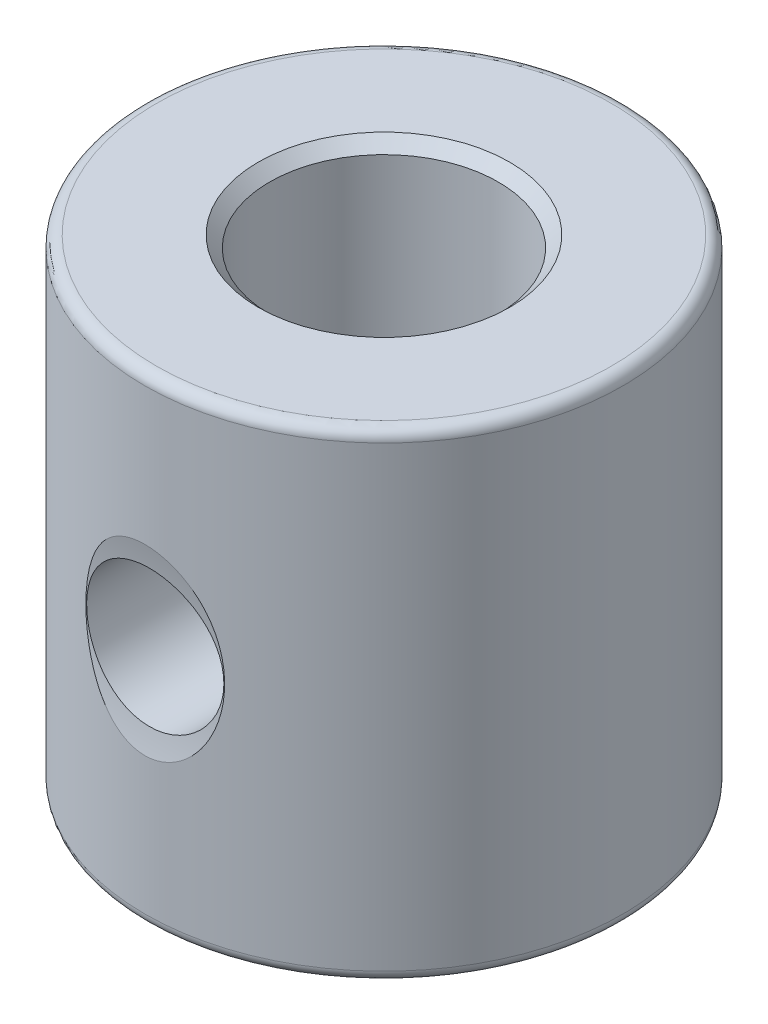
ISO-10303-21;
HEADER;
FILE_DESCRIPTION(('STEP AP214'),'2;1');
FILE_NAME('part.step','',(''),(''),'','','');
FILE_SCHEMA(('AUTOMOTIVE_DESIGN { 1 0 10303 214 1 1 1 1 }'));
ENDSEC;
DATA;
#1=APPLICATION_CONTEXT('core data for automotive mechanical design processes');
#2=APPLICATION_PROTOCOL_DEFINITION('international standard','automotive_design',2000,#1);
#3=PRODUCT_CONTEXT('',#1,'mechanical');
#4=PRODUCT('Part','Part','',(#3));
#5=PRODUCT_RELATED_PRODUCT_CATEGORY('part','',(#4));
#6=PRODUCT_DEFINITION_FORMATION('','',#4);
#7=PRODUCT_DEFINITION_CONTEXT('part definition',#1,'design');
#8=PRODUCT_DEFINITION('design','',#6,#7);
#9=PRODUCT_DEFINITION_SHAPE('','',#8);
#10=(LENGTH_UNIT() NAMED_UNIT(*) SI_UNIT(.MILLI.,.METRE.));
#11=(NAMED_UNIT(*) PLANE_ANGLE_UNIT() SI_UNIT($,.RADIAN.));
#12=(NAMED_UNIT(*) SI_UNIT($,.STERADIAN.) SOLID_ANGLE_UNIT());
#13=UNCERTAINTY_MEASURE_WITH_UNIT(LENGTH_MEASURE(1.E-05),#10,'distance_accuracy_value','');
#14=(GEOMETRIC_REPRESENTATION_CONTEXT(3) GLOBAL_UNCERTAINTY_ASSIGNED_CONTEXT((#13)) GLOBAL_UNIT_ASSIGNED_CONTEXT((#10,
#11,#12)) REPRESENTATION_CONTEXT('',''));
#15=CARTESIAN_POINT('',(0.,0.,0.));
#16=DIRECTION('',(0.,0.,1.));
#17=DIRECTION('',(1.,0.,0.));
#18=AXIS2_PLACEMENT_3D('',#15,#16,#17);
#19=CARTESIAN_POINT('',(0.,5.25,0.));
#20=DIRECTION('',(0.,1.,0.));
#21=DIRECTION('',(0.,0.,1.));
#22=AXIS2_PLACEMENT_3D('',#19,#20,#21);
#23=PLANE('',#22);
#24=CARTESIAN_POINT('',(0.,5.25,0.));
#25=DIRECTION('',(0.,1.,0.));
#26=DIRECTION('',(0.,0.,1.));
#27=AXIS2_PLACEMENT_3D('',#24,#25,#26);
#28=CIRCLE('',#27,2.75);
#29=CARTESIAN_POINT('',(0.,5.25,2.75));
#30=VERTEX_POINT('',#29);
#31=EDGE_CURVE('E10',#30,#30,#28,.F.);
#32=ORIENTED_EDGE('',*,*,#31,.T.);
#33=EDGE_LOOP('',(#32));
#34=FACE_BOUND('',#33,.T.);
#35=CARTESIAN_POINT('',(0.,5.25,0.));
#36=DIRECTION('',(0.,1.,0.));
#37=DIRECTION('',(0.,0.,1.));
#38=AXIS2_PLACEMENT_3D('',#35,#36,#37);
#39=CIRCLE('',#38,4.975);
#40=CARTESIAN_POINT('',(0.,5.25,4.975));
#41=VERTEX_POINT('',#40);
#42=EDGE_CURVE('E54',#41,#41,#39,.T.);
#43=ORIENTED_EDGE('',*,*,#42,.T.);
#44=EDGE_LOOP('',(#43));
#45=FACE_BOUND('',#44,.T.);
#46=ADVANCED_FACE('F42',(#34,#45),#23,.T.);
#47=CARTESIAN_POINT('',(0.,-5.25,0.));
#48=DIRECTION('',(0.,1.,0.));
#49=DIRECTION('',(0.,0.,1.));
#50=AXIS2_PLACEMENT_3D('',#47,#48,#49);
#51=PLANE('',#50);
#52=CARTESIAN_POINT('',(0.,-5.25,0.));
#53=DIRECTION('',(0.,1.,0.));
#54=DIRECTION('',(0.,0.,1.));
#55=AXIS2_PLACEMENT_3D('',#52,#53,#54);
#56=CIRCLE('',#55,4.975);
#57=CARTESIAN_POINT('',(0.,-5.25,4.975));
#58=VERTEX_POINT('',#57);
#59=EDGE_CURVE('E58',#58,#58,#56,.F.);
#60=ORIENTED_EDGE('',*,*,#59,.T.);
#61=EDGE_LOOP('',(#60));
#62=FACE_BOUND('',#61,.T.);
#63=CARTESIAN_POINT('',(0.,-5.25,0.));
#64=DIRECTION('',(0.,1.,0.));
#65=DIRECTION('',(0.,0.,1.));
#66=AXIS2_PLACEMENT_3D('',#63,#64,#65);
#67=CIRCLE('',#66,2.5);
#68=CARTESIAN_POINT('',(0.,-5.25,2.5));
#69=VERTEX_POINT('',#68);
#70=EDGE_CURVE('E69',#69,#69,#67,.T.);
#71=ORIENTED_EDGE('',*,*,#70,.T.);
#72=EDGE_LOOP('',(#71));
#73=FACE_BOUND('',#72,.T.);
#74=ADVANCED_FACE('F112',(#62,#73),#51,.F.);
#75=CARTESIAN_POINT('',(0.,5.25,0.));
#76=DIRECTION('',(0.,-1.,0.));
#77=DIRECTION('',(0.,0.,-1.));
#78=AXIS2_PLACEMENT_3D('',#75,#76,#77);
#79=CYLINDRICAL_SURFACE('',#78,5.225);
#80=CARTESIAN_POINT('',(0.,-5.,0.));
#81=DIRECTION('',(0.,1.,0.));
#82=DIRECTION('',(0.,0.,1.));
#83=AXIS2_PLACEMENT_3D('',#80,#81,#82);
#84=CIRCLE('',#83,5.225);
#85=CARTESIAN_POINT('',(0.,-5.,5.225));
#86=VERTEX_POINT('',#85);
#87=EDGE_CURVE('E63',#86,#86,#84,.T.);
#88=ORIENTED_EDGE('',*,*,#87,.T.);
#89=EDGE_LOOP('',(#88));
#90=FACE_BOUND('',#89,.T.);
#91=CARTESIAN_POINT('',(0.,5.,0.));
#92=DIRECTION('',(0.,1.,0.));
#93=DIRECTION('',(0.,0.,1.));
#94=AXIS2_PLACEMENT_3D('',#91,#92,#93);
#95=CIRCLE('',#94,5.225);
#96=CARTESIAN_POINT('',(0.,5.,5.225));
#97=VERTEX_POINT('',#96);
#98=EDGE_CURVE('E66',#97,#97,#95,.F.);
#99=ORIENTED_EDGE('',*,*,#98,.T.);
#100=EDGE_LOOP('',(#99));
#101=FACE_BOUND('',#100,.T.);
#102=CARTESIAN_POINT('',(-1.51678113121175,0.,5.));
#103=CARTESIAN_POINT('',(-1.51678321022055,0.132246562424827,5.00000483225481));
#104=CARTESIAN_POINT('',(-1.50719327837875,0.264644992566501,5.00294030867008));
#105=CARTESIAN_POINT('',(-1.46839893936603,0.526672873017801,5.01446209397624));
#106=CARTESIAN_POINT('',(-1.43913554430422,0.656292782735162,5.02306539541794));
#107=CARTESIAN_POINT('',(-1.35960828719544,0.909631952310207,5.04517840997567));
#108=CARTESIAN_POINT('',(-1.30919671564784,1.03330275281817,5.05872254382973));
#109=CARTESIAN_POINT('',(-1.18589710394196,1.26832312229336,5.08903616845833));
#110=CARTESIAN_POINT('',(-1.11308892170455,1.37971458790452,5.10579412126831));
#111=CARTESIAN_POINT('',(-0.975804598333927,1.54491640050493,5.13335164035832));
#112=CARTESIAN_POINT('',(-0.918421954835064,1.60466680696672,5.14403196120628));
#113=CARTESIAN_POINT('',(-0.794666170189511,1.71427691010474,5.16459690415331));
#114=CARTESIAN_POINT('',(-0.728297055439117,1.76414101183159,5.17448187946343));
#115=CARTESIAN_POINT('',(-0.586755893144599,1.85175029324499,5.19244321625354));
#116=CARTESIAN_POINT('',(-0.511504458701384,1.88937280416208,5.20050103936119));
#117=CARTESIAN_POINT('',(-0.354805995663198,1.94906887648696,5.21352826217495));
#118=CARTESIAN_POINT('',(-0.273366984157227,1.9711621904581,5.21850158430093));
#119=CARTESIAN_POINT('',(-0.120094405397051,1.995904616155,5.2240957822282));
#120=CARTESIAN_POINT('',(-0.0486684616039803,2.00098703607869,5.2252607001651));
#121=CARTESIAN_POINT('',(0.09391349441082,1.99827064623499,5.22464135172689));
#122=CARTESIAN_POINT('',(0.165069597394887,1.99047664136749,5.22285818544342));
#123=CARTESIAN_POINT('',(0.299156205285173,1.9636781898376,5.21682682191889));
#124=CARTESIAN_POINT('',(0.362289659063328,1.94561927443901,5.21278697764039));
#125=CARTESIAN_POINT('',(0.484855091333049,1.90003844753162,5.20281889880508));
#126=CARTESIAN_POINT('',(0.544286738712234,1.87251569095011,5.19689049561307));
#127=CARTESIAN_POINT('',(0.662444748262349,1.80700293537155,5.18320181830283));
#128=CARTESIAN_POINT('',(0.72082270646492,1.76840941392818,5.17534150375361));
#129=CARTESIAN_POINT('',(0.831410504796924,1.68340687762648,5.15873184924829));
#130=CARTESIAN_POINT('',(0.883616370462198,1.63699287298182,5.14998194311919));
#131=CARTESIAN_POINT('',(1.00422502911845,1.51488842964339,5.12810615314578));
#132=CARTESIAN_POINT('',(1.06895577339638,1.43558416998177,5.1148275720386));
#133=CARTESIAN_POINT('',(1.18468644922787,1.26734731837281,5.08926948535221));
#134=CARTESIAN_POINT('',(1.23565667881344,1.17839447066111,5.07699218023252));
#135=CARTESIAN_POINT('',(1.33662312589042,0.968532563673905,5.05148489699328));
#136=CARTESIAN_POINT('',(1.38249899544552,0.845561360297463,5.0389209793328));
#137=CARTESIAN_POINT('',(1.45416080847563,0.593623034095723,5.01870603572134));
#138=CARTESIAN_POINT('',(1.47993827963615,0.464653406932462,5.01105708187161));
#139=CARTESIAN_POINT('',(1.5125453789755,0.202541371241045,5.00131234857186));
#140=CARTESIAN_POINT('',(1.51913762399179,0.0693671276810601,4.99928615493248));
#141=CARTESIAN_POINT('',(1.51294178089214,-0.196605147736394,5.00116355855813));
#142=CARTESIAN_POINT('',(1.50013598443562,-0.329402724827907,5.00507257404298));
#143=CARTESIAN_POINT('',(1.45237112724862,-0.604355028281176,5.0191587140662));
#144=CARTESIAN_POINT('',(1.4153386949208,-0.746129623197173,5.02991966770397));
#145=CARTESIAN_POINT('',(1.31563783370383,-1.01981710810465,5.05691666142625));
#146=CARTESIAN_POINT('',(1.25302772245074,-1.15175162971596,5.07314023193593));
#147=CARTESIAN_POINT('',(1.12858769972324,-1.35275591369665,5.10189278921466));
#148=CARTESIAN_POINT('',(1.07498227580127,-1.42706805573394,5.11357836914098));
#149=CARTESIAN_POINT('',(0.956596412372014,-1.56616949476311,5.13704054090297));
#150=CARTESIAN_POINT('',(0.891834254581806,-1.63097405441703,5.14881695420563));
#151=CARTESIAN_POINT('',(0.763935438655142,-1.73754471173015,5.16918136051242));
#152=CARTESIAN_POINT('',(0.702541959894916,-1.78135836354408,5.17796467040403));
#153=CARTESIAN_POINT('',(0.573188007724139,-1.85840629307536,5.19387282629748));
#154=CARTESIAN_POINT('',(0.505229932057441,-1.89164441464088,5.20099827462237));
#155=CARTESIAN_POINT('',(0.363755155049785,-1.9457762037588,5.21280818602999));
#156=CARTESIAN_POINT('',(0.290203117676717,-1.96658251037029,5.21747534772415));
#157=CARTESIAN_POINT('',(0.140367791148149,-1.9939651874736,5.22365048796671));
#158=CARTESIAN_POINT('',(0.0640864035238684,-2.00055127620779,5.22516062403629));
#159=CARTESIAN_POINT('',(-0.079178732952558,-1.99910518940569,5.22483223186299));
#160=CARTESIAN_POINT('',(-0.146185759766913,-1.99272361178179,5.2233717922668));
#161=CARTESIAN_POINT('',(-0.278102904485085,-1.96896408019153,5.21801121622705));
#162=CARTESIAN_POINT('',(-0.3430131051473,-1.95158656077623,5.21411117619468));
#163=CARTESIAN_POINT('',(-0.468653420259433,-1.90696495854449,5.20431948845676));
#164=CARTESIAN_POINT('',(-0.529408597969502,-1.8797876717991,5.19844134138564));
#165=CARTESIAN_POINT('',(-0.646089137239095,-1.81684472491262,5.185233589907));
#166=CARTESIAN_POINT('',(-0.702013237211039,-1.78107683058334,5.17790360800299));
#167=CARTESIAN_POINT('',(-0.815004339151255,-1.69740474362436,5.16140022991208));
#168=CARTESIAN_POINT('',(-0.87134206973075,-1.64854280589884,5.1521109394623));
#169=CARTESIAN_POINT('',(-0.976666330217274,-1.54353336918077,5.13318754711435));
#170=CARTESIAN_POINT('',(-1.02564714465205,-1.48738026829453,5.12355318425727));
#171=CARTESIAN_POINT('',(-1.1394305972897,-1.33914346780779,5.09972992710893));
#172=CARTESIAN_POINT('',(-1.19950070217935,-1.24337927966437,5.08573366380371));
#173=CARTESIAN_POINT('',(-1.30349087790626,-1.04310872530245,5.06007991409564));
#174=CARTESIAN_POINT('',(-1.34737614517184,-0.93858410593995,5.04842749200689));
#175=CARTESIAN_POINT('',(-1.42045996445929,-0.722242709805271,5.02835688987399));
#176=CARTESIAN_POINT('',(-1.44938886627917,-0.610330512029696,5.01999869640888));
#177=CARTESIAN_POINT('',(-1.49211250846632,-0.383658050304542,5.00746706776384));
#178=CARTESIAN_POINT('',(-1.5059379766792,-0.268904056542488,5.00328513749608));
#179=CARTESIAN_POINT('',(-1.51533586059249,-0.102587605252344,5.00043733088112));
#180=CARTESIAN_POINT('',(-1.51678032465749,-0.051305231145879,4.99999812532027));
#181=CARTESIAN_POINT('',(-1.51678113121175,0.,5.));
#182=B_SPLINE_CURVE_WITH_KNOTS('',3,(#102,#103,#104,#105,#106,#107,#108,#109,#110,#111,#112,
#113,#114,#115,#116,#117,#118,#119,#120,#121,#122,#123,#124,#125,#126,#127,#128,#129,#130,#131,
#132,#133,#134,#135,#136,#137,#138,#139,#140,#141,#142,#143,#144,#145,#146,#147,#148,#149,#150,
#151,#152,#153,#154,#155,#156,#157,#158,#159,#160,#161,#162,#163,#164,#165,#166,#167,#168,#169,
#170,#171,#172,#173,#174,#175,#176,#177,#178,#179,#180,#181),.UNSPECIFIED.,.T.,.F.,(4,2,2,2,2,2,
2,2,2,2,2,2,2,2,2,2,2,2,2,2,2,2,2,2,2,2,2,2,2,2,2,2,2,2,2,2,2,2,2,4),(0.,0.39661586491243,
0.794426257563585,1.19506267618054,1.59428681678833,1.84398007798795,2.09356183183857,
2.34557260493653,2.59726224674101,2.81092737260801,3.0245127863121,3.22103169732319,
3.4175681610289,3.62803147545051,3.83862958608082,4.14660285054154,4.4552356524094,
4.84871981990921,5.24236976787901,5.64087014998841,6.03973453969841,6.4782025811379,
6.91567643691321,7.19184454416813,7.46756434631155,7.69445639022458,7.92126587208373,
8.14965099800069,8.37787999371812,8.57887470278069,8.77986146918477,8.97950341496902,
9.17919733863566,9.40382685703782,9.62862999384581,9.96848832867347,10.3090732850905,
10.6556015297924,11.0014234442594,11.1552911006457),.UNSPECIFIED.);
#183=CARTESIAN_POINT('',(-1.51678113121175,0.,5.));
#184=VERTEX_POINT('',#183);
#185=EDGE_CURVE('E78',#184,#184,#182,.T.);
#186=ORIENTED_EDGE('',*,*,#185,.T.);
#187=EDGE_LOOP('',(#186));
#188=FACE_BOUND('',#187,.T.);
#189=CARTESIAN_POINT('',(0.,1.5,-5.225));
#190=CARTESIAN_POINT('',(-0.0824495164985992,1.49999858607525,-5.22499904292199));
#191=CARTESIAN_POINT('',(-0.164913536229548,1.49317942583963,-5.22302956290618));
#192=CARTESIAN_POINT('',(-0.3274504165581,1.46614106062343,-5.21536484167336));
#193=CARTESIAN_POINT('',(-0.4075223788601,1.44591688611996,-5.2096682187356));
#194=CARTESIAN_POINT('',(-0.562906647574482,1.39279188993011,-5.19517524493691));
#195=CARTESIAN_POINT('',(-0.63822545505226,1.35990883971514,-5.18638324107416));
#196=CARTESIAN_POINT('',(-0.782280086892446,1.28246963544211,-5.1666194155132));
#197=CARTESIAN_POINT('',(-0.851015203470135,1.23791222824251,-5.15564735983582));
#198=CARTESIAN_POINT('',(-0.981774047674085,1.13714300060406,-5.13237413354688));
#199=CARTESIAN_POINT('',(-1.04359842097068,1.08067838683339,-5.12004748940824));
#200=CARTESIAN_POINT('',(-1.15704334957944,0.958236961618635,-5.09561087413215));
#201=CARTESIAN_POINT('',(-1.20866235795317,0.89225871070604,-5.08350093609583));
#202=CARTESIAN_POINT('',(-1.30124916910646,0.751014520317421,-5.06060303311927));
#203=CARTESIAN_POINT('',(-1.3419792739964,0.675587122576367,-5.04984692403333));
#204=CARTESIAN_POINT('',(-1.41009779264294,0.518595368105334,-5.03125280899525));
#205=CARTESIAN_POINT('',(-1.43748910750096,0.437032350292604,-5.02341416859984));
#206=CARTESIAN_POINT('',(-1.47744422828539,0.272311432022153,-5.01180699088508));
#207=CARTESIAN_POINT('',(-1.49037319160683,0.189249335112857,-5.00793843296186));
#208=CARTESIAN_POINT('',(-1.5021761878103,0.0220519028465292,-5.00441135169317));
#209=CARTESIAN_POINT('',(-1.50105330709256,-0.0620831927774272,-5.00475190384262));
#210=CARTESIAN_POINT('',(-1.48507252937531,-0.22611777880433,-5.00951556540055));
#211=CARTESIAN_POINT('',(-1.47066569707202,-0.306065741568654,-5.01380459433462));
#212=CARTESIAN_POINT('',(-1.42925220446176,-0.462358727517765,-5.02576592329153));
#213=CARTESIAN_POINT('',(-1.40224439530918,-0.538703421489377,-5.03343853179573));
#214=CARTESIAN_POINT('',(-1.33604943281944,-0.686754861869461,-5.05141381890988));
#215=CARTESIAN_POINT('',(-1.29671129372482,-0.758390012324849,-5.06174880261282));
#216=CARTESIAN_POINT('',(-1.20707740700734,-0.894196488732472,-5.08386809046487));
#217=CARTESIAN_POINT('',(-1.15677919942196,-0.958366134101287,-5.09565271972464));
#218=CARTESIAN_POINT('',(-1.04438621900762,-1.07998620247547,-5.11989302539654));
#219=CARTESIAN_POINT('',(-0.981915278301574,-1.13708786414149,-5.13235716963812));
#220=CARTESIAN_POINT('',(-0.848129684395266,-1.2400817626457,-5.15615270470673));
#221=CARTESIAN_POINT('',(-0.776814564388958,-1.28597340742623,-5.1674840356855));
#222=CARTESIAN_POINT('',(-0.626768862071928,-1.3654325911413,-5.18782637306562));
#223=CARTESIAN_POINT('',(-0.547998381865395,-1.3989284951806,-5.19682380520067));
#224=CARTESIAN_POINT('',(-0.3856250678235,-1.45209715472824,-5.2113867643945));
#225=CARTESIAN_POINT('',(-0.302023469993159,-1.47177342908747,-5.21695316504231));
#226=CARTESIAN_POINT('',(-0.135330517791554,-1.49617694983916,-5.22389111514313));
#227=CARTESIAN_POINT('',(-0.052313865600352,-1.50137744200586,-5.22539541289476));
#228=CARTESIAN_POINT('',(0.113408569933314,-1.49800039973381,-5.22442599408047));
#229=CARTESIAN_POINT('',(0.196114389747752,-1.48942453578542,-5.22195275982121));
#230=CARTESIAN_POINT('',(0.35712014762491,-1.45912328919309,-5.2133926592024));
#231=CARTESIAN_POINT('',(0.435475522333118,-1.43766940578765,-5.20738045218129));
#232=CARTESIAN_POINT('',(0.587461852887813,-1.3825431973504,-5.19243200422949));
#233=CARTESIAN_POINT('',(0.661092258978544,-1.34886945354565,-5.18349542377959));
#234=CARTESIAN_POINT('',(0.803319129185434,-1.26943198030226,-5.16338825649625));
#235=CARTESIAN_POINT('',(0.871770921777237,-1.22342077027359,-5.15217322888593));
#236=CARTESIAN_POINT('',(1.00014523868148,-1.12091919858366,-5.12880094150437));
#237=CARTESIAN_POINT('',(1.0600657984176,-1.06442643010009,-5.116643465698));
#238=CARTESIAN_POINT('',(1.17172562333316,-0.940346448017199,-5.09225514610833));
#239=CARTESIAN_POINT('',(1.22312909697744,-0.872454301496108,-5.08003515404982));
#240=CARTESIAN_POINT('',(1.31383058167793,-0.728743871428044,-5.05733805554333));
#241=CARTESIAN_POINT('',(1.3531290056246,-0.652925858342176,-5.04686088965498));
#242=CARTESIAN_POINT('',(1.41821961789411,-0.495824348017976,-5.0289580229563));
#243=CARTESIAN_POINT('',(1.44408269934611,-0.414572145936182,-5.02151635069317));
#244=CARTESIAN_POINT('',(1.48169600201518,-0.248616359459189,-5.01054819382922));
#245=CARTESIAN_POINT('',(1.4934505509538,-0.163913841678111,-5.00702050865762));
#246=CARTESIAN_POINT('',(1.50223633057733,0.00307077393275622,-5.00439099509517));
#247=CARTESIAN_POINT('',(1.49981170925004,0.0853220610257415,-5.00512558644907));
#248=CARTESIAN_POINT('',(1.48159220103079,0.248190643094908,-5.01054866722178));
#249=CARTESIAN_POINT('',(1.46579776832926,0.328807993482852,-5.0152370223259));
#250=CARTESIAN_POINT('',(1.42162454341136,0.485313040788899,-5.02793441867644));
#251=CARTESIAN_POINT('',(1.39337830460819,0.561241198905154,-5.03590842623189));
#252=CARTESIAN_POINT('',(1.32520584596704,0.707340772140516,-5.05427493283382));
#253=CARTESIAN_POINT('',(1.28527754255945,0.777511157463487,-5.0646678632427));
#254=CARTESIAN_POINT('',(1.19329798796334,0.912657666779304,-5.08713815227838));
#255=CARTESIAN_POINT('',(1.140883784404,0.977379309847944,-5.09926044744725));
#256=CARTESIAN_POINT('',(1.02608829683388,1.09728500036482,-5.12359297007803));
#257=CARTESIAN_POINT('',(0.963704499418225,1.15246663538715,-5.13580321897045));
#258=CARTESIAN_POINT('',(0.828786708500054,1.25314760175575,-5.1593159162724));
#259=CARTESIAN_POINT('',(0.756031102240528,1.29835811008878,-5.17058653473877));
#260=CARTESIAN_POINT('',(0.603628164623409,1.37583834607352,-5.19058264155035));
#261=CARTESIAN_POINT('',(0.523984577518027,1.40811505134721,-5.19930950152625));
#262=CARTESIAN_POINT('',(0.370722796071474,1.45538296662693,-5.21232389994314));
#263=CARTESIAN_POINT('',(0.297660522381918,1.47207170579655,-5.21704006335329));
#264=CARTESIAN_POINT('',(0.149735987660759,1.49438010794722,-5.22337833648225));
#265=CARTESIAN_POINT('',(0.0748739740943221,1.50000128401196,-5.22500086914074));
#266=CARTESIAN_POINT('',(0.,1.5,-5.225));
#267=B_SPLINE_CURVE_WITH_KNOTS('',3,(#189,#190,#191,#192,#193,#194,#195,#196,#197,#198,#199,
#200,#201,#202,#203,#204,#205,#206,#207,#208,#209,#210,#211,#212,#213,#214,#215,#216,#217,#218,
#219,#220,#221,#222,#223,#224,#225,#226,#227,#228,#229,#230,#231,#232,#233,#234,#235,#236,#237,
#238,#239,#240,#241,#242,#243,#244,#245,#246,#247,#248,#249,#250,#251,#252,#253,#254,#255,#256,
#257,#258,#259,#260,#261,#262,#263,#264,#265,#266),.UNSPECIFIED.,.T.,.F.,(4,2,2,2,2,2,2,2,2,2,2,
2,2,2,2,2,2,2,2,2,2,2,2,2,2,2,2,2,2,2,2,2,2,2,2,2,2,2,4),(0.,0.247073701447568,
0.494239049620807,0.74105866667298,0.987904788544549,1.24064287522474,1.49341924284957,
1.75133107017492,2.00918677824834,2.26037365184566,2.51150535477541,2.75441179327978,
2.99734038217353,3.24336820437644,3.48945130394989,3.74490189394383,4.00036597265916,
4.25728413794885,4.51413686119651,4.76248793864931,5.01080890387478,5.25407000557068,
5.49735935985988,5.74595063585013,5.99459906528555,6.25146426805533,6.50832070845414,
6.7638076856233,7.01921627339957,7.26488912847212,7.51055363804316,7.75366385029519,
7.99681744924082,8.24815901430193,8.49956404459484,8.75750120550819,9.01529902465739,
9.23970203321968,9.46407436076253),.UNSPECIFIED.);
#268=CARTESIAN_POINT('',(0.,1.5,-5.225));
#269=VERTEX_POINT('',#268);
#270=EDGE_CURVE('E101',#269,#269,#267,.T.);
#271=ORIENTED_EDGE('',*,*,#270,.T.);
#272=EDGE_LOOP('',(#271));
#273=FACE_BOUND('',#272,.T.);
#274=ADVANCED_FACE('F106',(#90,#101,#188,#273),#79,.T.);
#275=CARTESIAN_POINT('',(0.,5.25,0.));
#276=DIRECTION('',(0.,-1.,0.));
#277=DIRECTION('',(0.,0.,-1.));
#278=AXIS2_PLACEMENT_3D('',#275,#276,#277);
#279=CYLINDRICAL_SURFACE('',#278,2.5);
#280=CARTESIAN_POINT('',(0.,5.,0.));
#281=DIRECTION('',(0.,1.,0.));
#282=DIRECTION('',(0.,0.,1.));
#283=AXIS2_PLACEMENT_3D('',#280,#281,#282);
#284=CIRCLE('',#283,2.5);
#285=CARTESIAN_POINT('',(0.,5.,2.5));
#286=VERTEX_POINT('',#285);
#287=EDGE_CURVE('E50',#286,#286,#284,.T.);
#288=ORIENTED_EDGE('',*,*,#287,.T.);
#289=EDGE_LOOP('',(#288));
#290=FACE_BOUND('',#289,.T.);
#291=CARTESIAN_POINT('',(0.,1.5,-2.5));
#292=CARTESIAN_POINT('',(-0.0767298334620157,1.49999590899012,-2.49999625789732));
#293=CARTESIAN_POINT('',(-0.153582320644178,1.49407132907374,-2.4964290461501));
#294=CARTESIAN_POINT('',(-0.304975509530679,1.47067568048467,-2.48249903608568));
#295=CARTESIAN_POINT('',(-0.379510034596047,1.45317613814578,-2.47211948032719));
#296=CARTESIAN_POINT('',(-0.523751827790837,1.40761363883314,-2.44561558054488));
#297=CARTESIAN_POINT('',(-0.593481028226566,1.37960304183684,-2.42951973272944));
#298=CARTESIAN_POINT('',(-0.727030318214659,1.31413966685897,-2.39295367626407));
#299=CARTESIAN_POINT('',(-0.790851869416383,1.27668923303125,-2.37248455380255));
#300=CARTESIAN_POINT('',(-0.916299278999315,1.19022517329142,-2.32705360719088));
#301=CARTESIAN_POINT('',(-0.977384020081415,1.14054630464861,-2.30186792195985));
#302=CARTESIAN_POINT('',(-1.09088270411891,1.03253279617173,-2.25030439279634));
#303=CARTESIAN_POINT('',(-1.14328534948112,0.974187062812683,-2.22392505153571));
#304=CARTESIAN_POINT('',(-1.24444996762974,0.842076489503268,-2.1691106699591));
#305=CARTESIAN_POINT('',(-1.29197766378809,0.767298229018711,-2.14082017703649));
#306=CARTESIAN_POINT('',(-1.37361437764896,0.609153426756886,-2.08938301412124));
#307=CARTESIAN_POINT('',(-1.4077451733516,0.525801103752432,-2.06622802273938));
#308=CARTESIAN_POINT('',(-1.45440601714221,0.37340354934676,-2.0335462966093));
#309=CARTESIAN_POINT('',(-1.47016197246826,0.305764001389683,-2.02207883137591));
#310=CARTESIAN_POINT('',(-1.49216172340475,0.168196284169636,-2.00590308295503));
#311=CARTESIAN_POINT('',(-1.49841734556836,0.0982710712455062,-2.00118639643759));
#312=CARTESIAN_POINT('',(-1.50105508796009,-0.0420114942173355,-1.99920922463856));
#313=CARTESIAN_POINT('',(-1.49741783408419,-0.112369425093197,-2.00196337012718));
#314=CARTESIAN_POINT('',(-1.48046060478828,-0.251278775427587,-2.01453261443741));
#315=CARTESIAN_POINT('',(-1.46713334620103,-0.319828795847444,-2.02435302432226));
#316=CARTESIAN_POINT('',(-1.43173921881792,-0.452530242128105,-2.04953186944258));
#317=CARTESIAN_POINT('',(-1.40978748666087,-0.516727053924482,-2.06481711652537));
#318=CARTESIAN_POINT('',(-1.35795061770837,-0.640694990928123,-2.09927051350828));
#319=CARTESIAN_POINT('',(-1.32806257259705,-0.700464483423925,-2.11844008623465));
#320=CARTESIAN_POINT('',(-1.25517983184583,-0.824984097122803,-2.16255327268985));
#321=CARTESIAN_POINT('',(-1.21080724397723,-0.888778092954926,-2.18792043372992));
#322=CARTESIAN_POINT('',(-1.11291092784003,-1.00867648366702,-2.23930599764381));
#323=CARTESIAN_POINT('',(-1.05937845100579,-1.06477343397651,-2.26532500262149));
#324=CARTESIAN_POINT('',(-0.935811834382966,-1.17561298182176,-2.31935504958317));
#325=CARTESIAN_POINT('',(-0.864517682704957,-1.22907730601599,-2.34713836268532));
#326=CARTESIAN_POINT('',(-0.712276050459,-1.32312204719791,-2.39772428433981));
#327=CARTESIAN_POINT('',(-0.631333763943564,-1.36370935378995,-2.42052955425515));
#328=CARTESIAN_POINT('',(-0.467197585268206,-1.4279321827959,-2.45730392066151));
#329=CARTESIAN_POINT('',(-0.38446762417358,-1.45247535571591,-2.47173957439704));
#330=CARTESIAN_POINT('',(-0.215047895144639,-1.48701119740538,-2.49218842813551));
#331=CARTESIAN_POINT('',(-0.128363005661319,-1.49702131775358,-2.49821172952738));
#332=CARTESIAN_POINT('',(0.0337146143773964,-1.50150784767831,-2.5009057037461));
#333=CARTESIAN_POINT('',(0.109042473418718,-1.49790885508517,-2.49873521714286));
#334=CARTESIAN_POINT('',(0.25782940198606,-1.47957414692808,-2.48778712087048));
#335=CARTESIAN_POINT('',(0.331288509376106,-1.46483865719419,-2.47900964518037));
#336=CARTESIAN_POINT('',(0.472574932157613,-1.42545656718754,-2.4559479244219));
#337=CARTESIAN_POINT('',(0.540495750928484,-1.40105965092653,-2.44180275662555));
#338=CARTESIAN_POINT('',(0.671265749087263,-1.34332262363473,-2.40913880862844));
#339=CARTESIAN_POINT('',(0.734113924963908,-1.30998074865333,-2.39061916586511));
#340=CARTESIAN_POINT('',(0.860006262823864,-1.23144302079129,-2.3484549623736));
#341=CARTESIAN_POINT('',(0.922394150456837,-1.18537617092161,-2.3244780273988));
#342=CARTESIAN_POINT('',(1.03902603131014,-1.08460860651138,-2.27474265574732));
#343=CARTESIAN_POINT('',(1.09326040273738,-1.02989784514746,-2.2489821658636));
#344=CARTESIAN_POINT('',(1.19931996735579,-0.905089609962848,-2.19445423909891));
#345=CARTESIAN_POINT('',(1.24991019630915,-0.833916114534496,-2.16573241746291));
#346=CARTESIAN_POINT('',(1.33845238915667,-0.682783975431796,-2.1121618206671));
#347=CARTESIAN_POINT('',(1.37641766769781,-0.602834706107215,-2.0873089799769));
#348=CARTESIAN_POINT('',(1.43142578795776,-0.453756977693311,-2.04984909240519));
#349=CARTESIAN_POINT('',(1.4512162533619,-0.386019687641411,-2.03575659328729));
#350=CARTESIAN_POINT('',(1.48113663905972,-0.247467921919896,-2.01409605743544));
#351=CARTESIAN_POINT('',(1.49127995297631,-0.176657855672172,-2.00651897642721));
#352=CARTESIAN_POINT('',(1.50134130416631,-0.0336230524029677,-1.99900446616268));
#353=CARTESIAN_POINT('',(1.50122089107869,0.0386059906870432,-1.99909576445937));
#354=CARTESIAN_POINT('',(1.49066472959328,0.181894435609459,-2.0069771789285));
#355=CARTESIAN_POINT('',(1.48022337215759,0.252953180080596,-2.0147714813882));
#356=CARTESIAN_POINT('',(1.45040174148913,0.388488417572186,-2.0363318524298));
#357=CARTESIAN_POINT('',(1.43147636845351,0.453117094306871,-2.04979211805581));
#358=CARTESIAN_POINT('',(1.38563242076993,0.578337254474216,-2.08105501960151));
#359=CARTESIAN_POINT('',(1.35871083588479,0.638927206960553,-2.09885929040482));
#360=CARTESIAN_POINT('',(1.29289245555732,0.76431985722078,-2.14012990550917));
#361=CARTESIAN_POINT('',(1.25279167675753,0.828341103854308,-2.16404587582639));
#362=CARTESIAN_POINT('',(1.16375698389084,0.949380072617291,-2.21320127030768));
#363=CARTESIAN_POINT('',(1.11481579607798,1.00639196215256,-2.23844177205021));
#364=CARTESIAN_POINT('',(1.00009777425734,1.12135094913167,-2.29225690291476));
#365=CARTESIAN_POINT('',(0.932876819313904,1.17793107489619,-2.32070308663658));
#366=CARTESIAN_POINT('',(0.788462434445589,1.27909785586331,-2.37365428872367));
#367=CARTESIAN_POINT('',(0.711265444501539,1.32368021198479,-2.39815789310936));
#368=CARTESIAN_POINT('',(0.551125230801453,1.39778580757374,-2.43985578654394));
#369=CARTESIAN_POINT('',(0.468430086957213,1.42772806492683,-2.45725077479787));
#370=CARTESIAN_POINT('',(0.297973306118807,1.47272469521098,-2.48366273001246));
#371=CARTESIAN_POINT('',(0.210232099648612,1.48783516785699,-2.49271125871485));
#372=CARTESIAN_POINT('',(0.101558096917536,1.49669745470866,-2.49802001168187));
#373=CARTESIAN_POINT('',(0.0812762590282772,1.4979344173061,-2.49876114656362));
#374=CARTESIAN_POINT('',(0.0406658206871122,1.49958624637086,-2.49975164517367));
#375=CARTESIAN_POINT('',(0.0203372186375694,1.5000010843209,-2.50000099184316));
#376=CARTESIAN_POINT('',(0.,1.5,-2.5));
#377=B_SPLINE_CURVE_WITH_KNOTS('',3,(#291,#292,#293,#294,#295,#296,#297,#298,#299,#300,#301,
#302,#303,#304,#305,#306,#307,#308,#309,#310,#311,#312,#313,#314,#315,#316,#317,#318,#319,#320,
#321,#322,#323,#324,#325,#326,#327,#328,#329,#330,#331,#332,#333,#334,#335,#336,#337,#338,#339,
#340,#341,#342,#343,#344,#345,#346,#347,#348,#349,#350,#351,#352,#353,#354,#355,#356,#357,#358,
#359,#360,#361,#362,#363,#364,#365,#366,#367,#368,#369,#370,#371,#372,#373,#374,#375,#376),
.UNSPECIFIED.,.T.,.F.,(4,2,2,2,2,2,2,2,2,2,2,2,2,2,2,2,2,2,2,2,2,2,2,2,2,2,2,2,2,2,2,2,2,2,2,2,
2,2,2,2,2,2,4),(0.,0.230102237548649,0.460772627520012,0.690308884600012,0.919788197992275,
1.16681590732473,1.414162579348,1.69183813189807,1.96906040692092,2.17933829855633,
2.38935420916578,2.59978170870726,2.81036753273872,3.01823267593207,3.22617409809868,
3.47046995225163,3.71500044803674,3.99360957884691,4.27206939275324,4.5329679069656,
4.79355286918236,5.01875602722426,5.24395461863455,5.46367785689772,5.68344445659025,
5.92601365818362,6.16886690081836,6.44336762428009,6.71757792616456,6.93257787314692,
7.14727888733319,7.36278425777433,7.57840681155725,7.78364098331142,7.98895251523035,
8.22578610052286,8.46281544370208,8.73854311775519,9.01436946031985,9.28175654462677,
9.54812832184448,9.60911473335177,9.6701032602764),.UNSPECIFIED.);
#378=CARTESIAN_POINT('',(0.,1.5,-2.5));
#379=VERTEX_POINT('',#378);
#380=EDGE_CURVE('E79',#379,#379,#377,.T.);
#381=ORIENTED_EDGE('',*,*,#380,.F.);
#382=EDGE_LOOP('',(#381));
#383=FACE_BOUND('',#382,.T.);
#384=CARTESIAN_POINT('',(1.5,0.,2.));
#385=CARTESIAN_POINT('',(1.50000404108592,-0.0754789752896367,1.99999416642512));
#386=CARTESIAN_POINT('',(1.49426852824013,-0.150938434079796,2.00433633903481));
#387=CARTESIAN_POINT('',(1.47174965152787,-0.299323903962216,2.02092590613883));
#388=CARTESIAN_POINT('',(1.45495475788936,-0.372247187385098,2.03318155043097));
#389=CARTESIAN_POINT('',(1.41143486335795,-0.513083641677277,2.0636233903473));
#390=CARTESIAN_POINT('',(1.3847815450315,-0.581028838035267,2.0817666618312));
#391=CARTESIAN_POINT('',(1.32252909283019,-0.711437453367919,2.12185904995836));
#392=CARTESIAN_POINT('',(1.28692729054693,-0.773899229695138,2.14380930122416));
#393=CARTESIAN_POINT('',(1.20271292747644,-0.899949016664082,2.19228594587542));
#394=CARTESIAN_POINT('',(1.15304179435289,-0.962740957123942,2.21904371037662));
#395=CARTESIAN_POINT('',(1.04426801309985,-1.07976476274175,2.27226229431061));
#396=CARTESIAN_POINT('',(0.985158296729613,-1.1339901516708,2.29872287517103));
#397=CARTESIAN_POINT('',(0.851442367411702,-1.2381338097097,2.35175567858734));
#398=CARTESIAN_POINT('',(0.775851995162548,-1.28695446366975,2.37803133577818));
#399=CARTESIAN_POINT('',(0.615654228271659,-1.37080972244443,2.42443786983179));
#400=CARTESIAN_POINT('',(0.531055196626331,-1.40585697412271,2.44457437988735));
#401=CARTESIAN_POINT('',(0.363771406742667,-1.45759592281265,2.4747098780044));
#402=CARTESIAN_POINT('',(0.281674698130916,-1.4757203609673,2.4854930393917));
#403=CARTESIAN_POINT('',(0.114970509382709,-1.49794280286312,2.49874939277545));
#404=CARTESIAN_POINT('',(0.030365462400154,-1.50205397800005,2.50123038813307));
#405=CARTESIAN_POINT('',(-0.127637283737309,-1.49638625265754,2.49783372711539));
#406=CARTESIAN_POINT('',(-0.201123832865634,-1.48826647383069,2.49295437513726));
#407=CARTESIAN_POINT('',(-0.345464269151768,-1.46152020435189,2.47707997553857));
#408=CARTESIAN_POINT('',(-0.416317961051201,-1.44289293609285,2.46608447529309));
#409=CARTESIAN_POINT('',(-0.554056780469079,-1.39583443729622,2.43884907201719));
#410=CARTESIAN_POINT('',(-0.620916491037617,-1.367346938861,2.42257910450824));
#411=CARTESIAN_POINT('',(-0.748988660115611,-1.30161538377446,2.38609637638748));
#412=CARTESIAN_POINT('',(-0.810199646208011,-1.26436905294099,2.36588259201812));
#413=CARTESIAN_POINT('',(-0.933074267143199,-1.17716090719555,2.32037925976363));
#414=CARTESIAN_POINT('',(-0.993918663198193,-1.12621168826426,2.2947718295215));
#415=CARTESIAN_POINT('',(-1.10671465909275,-1.01559588213982,2.24255554245601));
#416=CARTESIAN_POINT('',(-1.1586540130834,-0.955917496525494,2.21594536703375));
#417=CARTESIAN_POINT('',(-1.25824837767417,-0.821346593836446,2.16111075123946));
#418=CARTESIAN_POINT('',(-1.30470933188632,-0.745492423460539,2.13305661385124));
#419=CARTESIAN_POINT('',(-1.38397217194232,-0.585293768363393,2.08250879557267));
#420=CARTESIAN_POINT('',(-1.41679921962189,-0.500965283874358,2.0600049029882));
#421=CARTESIAN_POINT('',(-1.46077497064842,-0.347606368104652,2.02895865196731));
#422=CARTESIAN_POINT('',(-1.47527903312665,-0.279959367703357,2.01833888618316));
#423=CARTESIAN_POINT('',(-1.49480872755284,-0.142626389700518,2.00392150777558));
#424=CARTESIAN_POINT('',(-1.49984538302907,-0.0729428795154367,2.00011596115116));
#425=CARTESIAN_POINT('',(-1.50014781114183,0.0665516824357073,1.99988914321323));
#426=CARTESIAN_POINT('',(-1.49540004697659,0.13636277721521,2.00347810223984));
#427=CARTESIAN_POINT('',(-1.47640290574941,0.273987343748558,2.01751520788652));
#428=CARTESIAN_POINT('',(-1.46214601830139,0.341799192240254,2.02796877613213));
#429=CARTESIAN_POINT('',(-1.42488312618657,0.473714579479786,2.054317683331));
#430=CARTESIAN_POINT('',(-1.40188805257362,0.53782263653223,2.07020622092812));
#431=CARTESIAN_POINT('',(-1.34796261057072,0.661477715730181,2.10571539417587));
#432=CARTESIAN_POINT('',(-1.31702924888212,0.721023006366002,2.12533743689999));
#433=CARTESIAN_POINT('',(-1.24167439558512,0.845240082512246,2.17036819177737));
#434=CARTESIAN_POINT('',(-1.19582663060303,0.908900835096568,2.19618239397369));
#435=CARTESIAN_POINT('',(-1.09487395518701,1.02828548484946,2.2482175480362));
#436=CARTESIAN_POINT('',(-1.03976018672402,1.08400169216912,2.27443886711455));
#437=CARTESIAN_POINT('',(-0.913274837212766,1.19322400735043,2.32835625910913));
#438=CARTESIAN_POINT('',(-0.840721108780191,1.24550072660584,2.3558007587587));
#439=CARTESIAN_POINT('',(-0.686103100868019,1.33690277683665,2.40537639133459));
#440=CARTESIAN_POINT('',(-0.604045176134702,1.37603682784092,2.42751104449411));
#441=CARTESIAN_POINT('',(-0.438840232972138,1.43686820343137,2.46252280092775));
#442=CARTESIAN_POINT('',(-0.356205963651258,1.45962622779111,2.47595588067329));
#443=CARTESIAN_POINT('',(-0.187383063890857,1.49071460284626,2.494407389061));
#444=CARTESIAN_POINT('',(-0.101198571781969,1.49906129071762,2.49943534582737));
#445=CARTESIAN_POINT('',(0.0598120232009841,1.50067460858593,2.50040600461976));
#446=CARTESIAN_POINT('',(0.134620583589706,1.49580333456303,2.49747057186327));
#447=CARTESIAN_POINT('',(0.282148755978774,1.47510617561839,2.48512948412095));
#448=CARTESIAN_POINT('',(0.354868344701914,1.4592801686784,2.47572375706639));
#449=CARTESIAN_POINT('',(0.495145481978797,1.41778042841621,2.45149427526962));
#450=CARTESIAN_POINT('',(0.56276703260883,1.39226840387076,2.43675966858906));
#451=CARTESIAN_POINT('',(0.692781971999984,1.33235940544525,2.40303337447155));
#452=CARTESIAN_POINT('',(0.755174184199832,1.2979604391404,2.38404073252268));
#453=CARTESIAN_POINT('',(0.880263645295947,1.21707480343124,2.34093432659381));
#454=CARTESIAN_POINT('',(0.94225869043994,1.16968129098313,2.31648844639149));
#455=CARTESIAN_POINT('',(1.05789751536307,1.06624696628228,2.26601907350661));
#456=CARTESIAN_POINT('',(1.11153190956916,1.01019657439209,2.23999385274509));
#457=CARTESIAN_POINT('',(1.2159097535057,0.882714437822301,2.18528165666204));
#458=CARTESIAN_POINT('',(1.26542406663368,0.810233513834501,2.15667566270901));
#459=CARTESIAN_POINT('',(1.35156817210325,0.656515147233459,2.10376464485145));
#460=CARTESIAN_POINT('',(1.38820466322661,0.575282286018585,2.07945738811052));
#461=CARTESIAN_POINT('',(1.44437116535132,0.412935714862797,2.0408000304796));
#462=CARTESIAN_POINT('',(1.46509526060187,0.332404764038753,2.02577665830138));
#463=CARTESIAN_POINT('',(1.49289268240426,0.16790260529632,2.00539032320036));
#464=CARTESIAN_POINT('',(1.49999550595837,0.0839392342412879,2.00000648744643));
#465=CARTESIAN_POINT('',(1.5,0.,2.));
#466=B_SPLINE_CURVE_WITH_KNOTS('',3,(#384,#385,#386,#387,#388,#389,#390,#391,#392,#393,#394,
#395,#396,#397,#398,#399,#400,#401,#402,#403,#404,#405,#406,#407,#408,#409,#410,#411,#412,#413,
#414,#415,#416,#417,#418,#419,#420,#421,#422,#423,#424,#425,#426,#427,#428,#429,#430,#431,#432,
#433,#434,#435,#436,#437,#438,#439,#440,#441,#442,#443,#444,#445,#446,#447,#448,#449,#450,#451,
#452,#453,#454,#455,#456,#457,#458,#459,#460,#461,#462,#463,#464,#465),.UNSPECIFIED.,.T.,.F.,(4,
2,2,2,2,2,2,2,2,2,2,2,2,2,2,2,2,2,2,2,2,2,2,2,2,2,2,2,2,2,2,2,2,2,2,2,2,2,2,2,4),(0.,
0.226085249493392,0.45240657433077,0.677113624991876,0.901887762215932,1.15414462390001,
1.40659128601844,1.68630157736223,1.9657544327122,2.21853330858497,2.47107452602766,
2.69230130543182,2.91354445887944,3.13607155036377,3.35865648368878,3.60782810055849,
3.85733966656908,4.13576671140276,4.41367760154768,4.62276298054684,4.83160475643976,
5.04073566011181,5.25003193304128,5.45906724365495,5.66818149154661,5.91499438482002,
6.16204457978454,6.44121828011588,6.72020638384847,6.97891479383337,7.23732973022726,
7.46129321849399,7.68525920139648,7.90563970188756,8.12606965394584,8.37042963549487,
8.61506198741955,8.89071695766604,9.16622832484805,9.41820120134354,9.66962780912277),.UNSPECIFIED.);
#467=CARTESIAN_POINT('',(1.5,0.,2.));
#468=VERTEX_POINT('',#467);
#469=EDGE_CURVE('E100',#468,#468,#466,.T.);
#470=ORIENTED_EDGE('',*,*,#469,.F.);
#471=EDGE_LOOP('',(#470));
#472=FACE_BOUND('',#471,.T.);
#473=ORIENTED_EDGE('',*,*,#70,.F.);
#474=EDGE_LOOP('',(#473));
#475=FACE_BOUND('',#474,.T.);
#476=ADVANCED_FACE('F111',(#290,#383,#472,#475),#279,.F.);
#477=CARTESIAN_POINT('',(0.,0.,-5.225));
#478=DIRECTION('',(0.,0.,1.));
#479=DIRECTION('',(1.,0.,0.));
#480=AXIS2_PLACEMENT_3D('',#477,#478,#479);
#481=CYLINDRICAL_SURFACE('',#480,1.5);
#482=CARTESIAN_POINT('',(1.5,0.,5.));
#483=CARTESIAN_POINT('',(1.49999664663131,0.0836345429749289,5.00000143298706));
#484=CARTESIAN_POINT('',(1.49298163501865,0.167314729103293,5.0011779325218));
#485=CARTESIAN_POINT('',(1.46511860474081,0.332328133003826,5.00575793035168));
#486=CARTESIAN_POINT('',(1.44425786585304,0.413659120775548,5.00916347645666));
#487=CARTESIAN_POINT('',(1.38935073084435,0.571562848327587,5.0178195905813));
#488=CARTESIAN_POINT('',(1.35531512061566,0.648139421059141,5.02306864904484));
#489=CARTESIAN_POINT('',(1.27505262476856,0.794485105186767,5.03483463750758));
#490=CARTESIAN_POINT('',(1.2288271335102,0.864254993927155,5.0413514224734));
#491=CARTESIAN_POINT('',(1.12502694970772,0.995683568575008,5.05500009525012));
#492=CARTESIAN_POINT('',(1.06735853121832,1.05726774212098,5.06213676911086));
#493=CARTESIAN_POINT('',(0.942511218916314,1.16993309919596,5.07618423873961));
#494=CARTESIAN_POINT('',(0.875331725126033,1.22101361963458,5.083095020224));
#495=CARTESIAN_POINT('',(0.732857420281766,1.31152027536308,5.09595460544132));
#496=CARTESIAN_POINT('',(0.657515197917146,1.3508727317166,5.10189722545018));
#497=CARTESIAN_POINT('',(0.501174261419624,1.41633501924673,5.11208126123195));
#498=CARTESIAN_POINT('',(0.420175929793421,1.44244574493937,5.11632279191416));
#499=CARTESIAN_POINT('',(0.255611835086076,1.48044862667088,5.12257677894347));
#500=CARTESIAN_POINT('',(0.172076558099165,1.49246941748124,5.1246093890858));
#501=CARTESIAN_POINT('',(0.00415183386991686,1.50235003517393,5.12627636638011));
#502=CARTESIAN_POINT('',(-0.0802375525003801,1.5002108642334,5.12591090325672));
#503=CARTESIAN_POINT('',(-0.24655671676527,1.48193705903769,5.12284142681867));
#504=CARTESIAN_POINT('',(-0.32850288212714,1.46594692913386,5.1201615600865));
#505=CARTESIAN_POINT('',(-0.48853279069748,1.42065188424207,5.11280302873395));
#506=CARTESIAN_POINT('',(-0.566616401333128,1.39134651259184,5.10812429556037));
#507=CARTESIAN_POINT('',(-0.717137294064552,1.32010634765635,5.0972691239954));
#508=CARTESIAN_POINT('',(-0.789545643648737,1.27811154832783,5.09108559735605));
#509=CARTESIAN_POINT('',(-0.926342640323032,1.18272721053446,5.07792248950995));
#510=CARTESIAN_POINT('',(-0.99073063947296,1.12933675239257,5.07094284407429));
#511=CARTESIAN_POINT('',(-1.11049565148441,1.01188932729543,5.05686783272129));
#512=CARTESIAN_POINT('',(-1.16575111112405,0.947708378323876,5.04977210461009));
#513=CARTESIAN_POINT('',(-1.2647266575992,0.810921149388987,5.03634439161966));
#514=CARTESIAN_POINT('',(-1.30844667010994,0.738314815143853,5.03001241166153));
#515=CARTESIAN_POINT('',(-1.38312133628177,0.586623549700026,5.01881664264253));
#516=CARTESIAN_POINT('',(-1.41406525159875,0.507533235338796,5.01395408955532));
#517=CARTESIAN_POINT('',(-1.46219652914759,0.345179007361638,5.00625498192404));
#518=CARTESIAN_POINT('',(-1.47938504218423,0.26191544350768,5.00341825789716));
#519=CARTESIAN_POINT('',(-1.49935281507668,0.0946259407809735,5.00011322094389));
#520=CARTESIAN_POINT('',(-1.50229894308336,0.010620442290606,4.99961748192329));
#521=CARTESIAN_POINT('',(-1.49414319334313,-0.156683863733933,5.00097515347298));
#522=CARTESIAN_POINT('',(-1.48304185611976,-0.239982698335224,5.00282847365529));
#523=CARTESIAN_POINT('',(-1.44724509039871,-0.402993705328059,5.00865903837079));
#524=CARTESIAN_POINT('',(-1.42263227496592,-0.482724521031228,5.01262337119214));
#525=CARTESIAN_POINT('',(-1.36059928908028,-0.636928130916266,5.02223321326785));
#526=CARTESIAN_POINT('',(-1.32317839941884,-0.711400629545832,5.02787881692788));
#527=CARTESIAN_POINT('',(-1.23620932518193,-0.853698413681376,5.04029290218556));
#528=CARTESIAN_POINT('',(-1.18655690629965,-0.921459150562289,5.04707086467787));
#529=CARTESIAN_POINT('',(-1.07667761076896,-1.04774615130161,5.0609691956486));
#530=CARTESIAN_POINT('',(-1.016449966034,-1.10627174381795,5.06808958897072));
#531=CARTESIAN_POINT('',(-0.886381471157145,-1.2130456677948,5.08195894858493));
#532=CARTESIAN_POINT('',(-0.816447500691353,-1.26118125666823,5.08870330317736));
#533=CARTESIAN_POINT('',(-0.669388218516876,-1.34502138617699,5.1009708213327));
#534=CARTESIAN_POINT('',(-0.592263134863502,-1.38072632086189,5.10649402360388));
#535=CARTESIAN_POINT('',(-0.43332616031272,-1.43852299888389,5.11565927781377));
#536=CARTESIAN_POINT('',(-0.351535142981706,-1.46067085952877,5.11930907413362));
#537=CARTESIAN_POINT('',(-0.185327922466942,-1.49090127226697,5.12433369898844));
#538=CARTESIAN_POINT('',(-0.100911948160768,-1.4989850471677,5.12570872530367));
#539=CARTESIAN_POINT('',(0.0670230995774463,-1.50082371962841,5.12601960149593));
#540=CARTESIAN_POINT('',(0.150540227145174,-1.49475608167511,5.1249856609661));
#541=CARTESIAN_POINT('',(0.31534754883046,-1.46884790337411,5.12066131127763));
#542=CARTESIAN_POINT('',(0.396637750165124,-1.44900740766749,5.11737090943272));
#543=CARTESIAN_POINT('',(0.554615062375569,-1.39618469375694,5.10891586230969));
#544=CARTESIAN_POINT('',(0.631307406033615,-1.36321775436027,5.10375339668198));
#545=CARTESIAN_POINT('',(0.778101401516909,-1.28509620234955,5.09213378646676));
#546=CARTESIAN_POINT('',(0.848202726223281,-1.23994098524914,5.08567657766961));
#547=CARTESIAN_POINT('',(0.980721349864653,-1.13809133062329,5.07209927572627));
#548=CARTESIAN_POINT('',(1.04303761002016,-1.08126633815619,5.06497222654218));
#549=CARTESIAN_POINT('',(1.15731096268496,-0.957965418828137,5.05091376583495));
#550=CARTESIAN_POINT('',(1.2092656611829,-0.891487267747581,5.04398239984072));
#551=CARTESIAN_POINT('',(1.30166896091997,-0.750221501784168,5.03104082214668));
#552=CARTESIAN_POINT('',(1.34203562358777,-0.675379672519691,5.02503730248138));
#553=CARTESIAN_POINT('',(1.40956169076595,-0.519907841627388,5.01469299438935));
#554=CARTESIAN_POINT('',(1.43673424864782,-0.439283696898006,5.01035055093511));
#555=CARTESIAN_POINT('',(1.471203164476,-0.29862198602724,5.00476525500227));
#556=CARTESIAN_POINT('',(1.48198468176958,-0.239435298179069,5.00298783635985));
#557=CARTESIAN_POINT('',(1.49638424270685,-0.120173586191886,5.00060470408327));
#558=CARTESIAN_POINT('',(1.50000240968242,-0.0600985773650967,4.99999897027615));
#559=CARTESIAN_POINT('',(1.5,0.,5.));
#560=B_SPLINE_CURVE_WITH_KNOTS('',3,(#482,#483,#484,#485,#486,#487,#488,#489,#490,#491,#492,
#493,#494,#495,#496,#497,#498,#499,#500,#501,#502,#503,#504,#505,#506,#507,#508,#509,#510,#511,
#512,#513,#514,#515,#516,#517,#518,#519,#520,#521,#522,#523,#524,#525,#526,#527,#528,#529,#530,
#531,#532,#533,#534,#535,#536,#537,#538,#539,#540,#541,#542,#543,#544,#545,#546,#547,#548,#549,
#550,#551,#552,#553,#554,#555,#556,#557,#558,#559),.UNSPECIFIED.,.T.,.F.,(4,2,2,2,2,2,2,2,2,2,2,
2,2,2,2,2,2,2,2,2,2,2,2,2,2,2,2,2,2,2,2,2,2,2,2,2,2,2,4),(0.,0.250683950963106,
0.501598527417252,0.752308120215163,1.00298904760487,1.25581494637399,1.50865680101914,
1.76305512494304,2.01743626125709,2.26947646262054,2.52149882592532,2.77092313056245,
3.02035599015229,3.27098733979535,3.52163892408344,3.77539661946796,4.02915594981509,
4.28312813349542,4.53707906712689,4.78804730094838,5.03900587821516,5.28844684203849,
5.5379018149564,5.78956095376214,6.0412383783257,6.29552293204572,6.54979942425566,
6.80301613405063,7.05621082671971,7.3062474571362,7.5562832771288,7.80602890935734,
8.05578693017602,8.30850830516035,8.56128800327383,8.8158133896432,9.07008451278043,
9.25022548898411,9.43036336366181),.UNSPECIFIED.);
#561=CARTESIAN_POINT('',(1.5,0.,5.));
#562=VERTEX_POINT('',#561);
#563=EDGE_CURVE('E70',#562,#562,#560,.T.);
#564=ORIENTED_EDGE('',*,*,#563,.T.);
#565=EDGE_LOOP('',(#564));
#566=FACE_BOUND('',#565,.T.);
#567=ORIENTED_EDGE('',*,*,#469,.T.);
#568=EDGE_LOOP('',(#567));
#569=FACE_BOUND('',#568,.T.);
#570=ADVANCED_FACE('F135',(#566,#569),#481,.F.);
#571=ORIENTED_EDGE('',*,*,#380,.T.);
#572=EDGE_LOOP('',(#571));
#573=FACE_BOUND('',#572,.T.);
#574=ORIENTED_EDGE('',*,*,#270,.F.);
#575=EDGE_LOOP('',(#574));
#576=FACE_BOUND('',#575,.T.);
#577=ADVANCED_FACE('F85',(#573,#576),#481,.F.);
#578=CARTESIAN_POINT('',(-5.225,0.,14.));
#579=DIRECTION('',(1.,0.,0.));
#580=DIRECTION('',(0.,0.,-1.));
#581=AXIS2_PLACEMENT_3D('',#578,#579,#580);
#582=CYLINDRICAL_SURFACE('',#581,9.);
#583=ORIENTED_EDGE('',*,*,#563,.F.);
#584=EDGE_LOOP('',(#583));
#585=FACE_BOUND('',#584,.T.);
#586=ORIENTED_EDGE('',*,*,#185,.F.);
#587=EDGE_LOOP('',(#586));
#588=FACE_BOUND('',#587,.T.);
#589=ADVANCED_FACE('F87',(#585,#588),#582,.F.);
#590=CARTESIAN_POINT('',(0.,-5.,0.));
#591=DIRECTION('',(0.,1.,0.));
#592=DIRECTION('',(0.,0.,1.));
#593=AXIS2_PLACEMENT_3D('',#590,#591,#592);
#594=TOROIDAL_SURFACE('',#593,4.975,0.25);
#595=ORIENTED_EDGE('',*,*,#59,.F.);
#596=EDGE_LOOP('',(#595));
#597=FACE_BOUND('',#596,.T.);
#598=ORIENTED_EDGE('',*,*,#87,.F.);
#599=EDGE_LOOP('',(#598));
#600=FACE_BOUND('',#599,.T.);
#601=ADVANCED_FACE('F90',(#597,#600),#594,.T.);
#602=CARTESIAN_POINT('',(0.,5.,0.));
#603=DIRECTION('',(0.,1.,0.));
#604=DIRECTION('',(0.,0.,1.));
#605=AXIS2_PLACEMENT_3D('',#602,#603,#604);
#606=TOROIDAL_SURFACE('',#605,4.975,0.25);
#607=ORIENTED_EDGE('',*,*,#98,.F.);
#608=EDGE_LOOP('',(#607));
#609=FACE_BOUND('',#608,.T.);
#610=ORIENTED_EDGE('',*,*,#42,.F.);
#611=EDGE_LOOP('',(#610));
#612=FACE_BOUND('',#611,.T.);
#613=ADVANCED_FACE('F117',(#609,#612),#606,.T.);
#614=CARTESIAN_POINT('',(0.,5.,0.));
#615=DIRECTION('',(0.,1.,0.));
#616=DIRECTION('',(0.,0.,1.));
#617=AXIS2_PLACEMENT_3D('',#614,#615,#616);
#618=CONICAL_SURFACE('',#617,2.5,0.785398163397448);
#619=ORIENTED_EDGE('',*,*,#31,.F.);
#620=EDGE_LOOP('',(#619));
#621=FACE_BOUND('',#620,.T.);
#622=ORIENTED_EDGE('',*,*,#287,.F.);
#623=EDGE_LOOP('',(#622));
#624=FACE_BOUND('',#623,.T.);
#625=ADVANCED_FACE('F45',(#621,#624),#618,.F.);
#626=CLOSED_SHELL('',(#46,#74,#274,#476,#570,#577,#589,#601,#613,#625));
#627=MANIFOLD_SOLID_BREP('B2',#626);
#628=ADVANCED_BREP_SHAPE_REPRESENTATION('',(#18,#627),#14);
#629=SHAPE_DEFINITION_REPRESENTATION(#9,#628);
ENDSEC;
END-ISO-10303-21;
